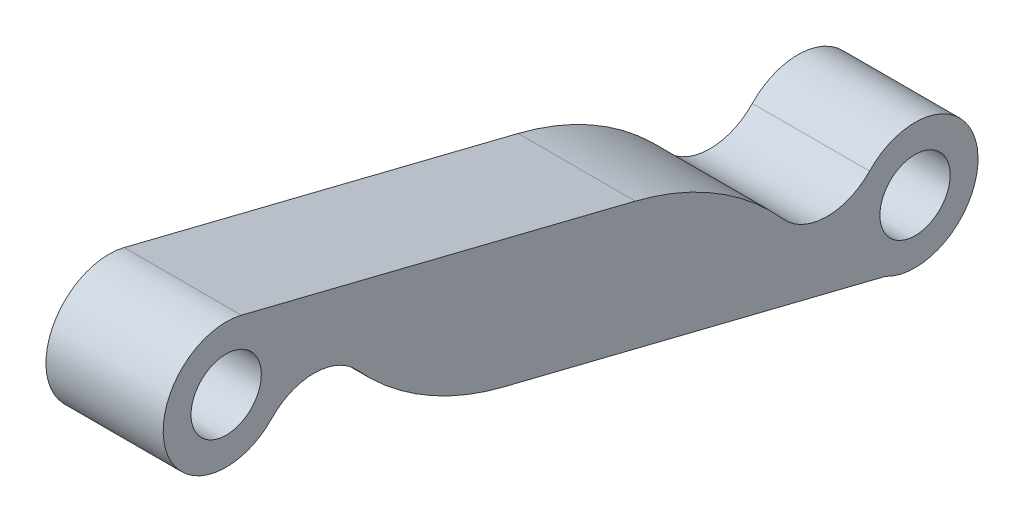
ISO-10303-21;
HEADER;
FILE_DESCRIPTION(('STEP AP214'),'2;1');
FILE_NAME('part.step','',(''),(''),'','','');
FILE_SCHEMA(('AUTOMOTIVE_DESIGN { 1 0 10303 214 1 1 1 1 }'));
ENDSEC;
DATA;
#1=APPLICATION_CONTEXT('core data for automotive mechanical design processes');
#2=APPLICATION_PROTOCOL_DEFINITION('international standard','automotive_design',2000,#1);
#3=PRODUCT_CONTEXT('',#1,'mechanical');
#4=PRODUCT('Part','Part','',(#3));
#5=PRODUCT_RELATED_PRODUCT_CATEGORY('part','',(#4));
#6=PRODUCT_DEFINITION_FORMATION('','',#4);
#7=PRODUCT_DEFINITION_CONTEXT('part definition',#1,'design');
#8=PRODUCT_DEFINITION('design','',#6,#7);
#9=PRODUCT_DEFINITION_SHAPE('','',#8);
#10=(LENGTH_UNIT() NAMED_UNIT(*) SI_UNIT(.MILLI.,.METRE.));
#11=(NAMED_UNIT(*) PLANE_ANGLE_UNIT() SI_UNIT($,.RADIAN.));
#12=(NAMED_UNIT(*) SI_UNIT($,.STERADIAN.) SOLID_ANGLE_UNIT());
#13=UNCERTAINTY_MEASURE_WITH_UNIT(LENGTH_MEASURE(1.E-05),#10,'distance_accuracy_value','');
#14=(GEOMETRIC_REPRESENTATION_CONTEXT(3) GLOBAL_UNCERTAINTY_ASSIGNED_CONTEXT((#13)) GLOBAL_UNIT_ASSIGNED_CONTEXT((#10,
#11,#12)) REPRESENTATION_CONTEXT('',''));
#15=CARTESIAN_POINT('',(0.,0.,0.));
#16=DIRECTION('',(0.,0.,1.));
#17=DIRECTION('',(1.,0.,0.));
#18=AXIS2_PLACEMENT_3D('',#15,#16,#17);
#19=CARTESIAN_POINT('',(-2.,-3.03108891324554,-26.340264052917));
#20=DIRECTION('',(1.,0.,0.));
#21=DIRECTION('',(0.,0.,-1.));
#22=AXIS2_PLACEMENT_3D('',#19,#20,#21);
#23=CYLINDRICAL_SURFACE('',#22,2.15);
#24=DIRECTION('',(1.,0.,0.));
#25=VECTOR('',#24,1.);
#26=CARTESIAN_POINT('',(-2.,-1.54552170545179,-24.7860471854472));
#27=LINE('',#26,#25);
#28=CARTESIAN_POINT('',(-2.,-1.54552170545179,-24.7860471854472));
#29=VERTEX_POINT('',#28);
#30=CARTESIAN_POINT('',(2.,-1.54552170545179,-24.7860471854472));
#31=VERTEX_POINT('',#30);
#32=EDGE_CURVE('E107',#29,#31,#27,.T.);
#33=ORIENTED_EDGE('',*,*,#32,.T.);
#34=CARTESIAN_POINT('',(2.,-3.03108891324554,-26.340264052917));
#35=DIRECTION('',(1.,0.,0.));
#36=DIRECTION('',(0.,0.,-1.));
#37=AXIS2_PLACEMENT_3D('',#34,#35,#36);
#38=CIRCLE('',#37,2.15);
#39=CARTESIAN_POINT('',(2.,-4.92963987266176,-25.3313020841096));
#40=VERTEX_POINT('',#39);
#41=EDGE_CURVE('E113',#40,#31,#38,.T.);
#42=ORIENTED_EDGE('',*,*,#41,.F.);
#43=DIRECTION('',(1.,0.,0.));
#44=VECTOR('',#43,1.);
#45=CARTESIAN_POINT('',(-2.,-4.92963987266176,-25.3313020841096));
#46=LINE('',#45,#44);
#47=CARTESIAN_POINT('',(-2.,-4.92963987266176,-25.3313020841096));
#48=VERTEX_POINT('',#47);
#49=EDGE_CURVE('E161',#48,#40,#46,.T.);
#50=ORIENTED_EDGE('',*,*,#49,.F.);
#51=CARTESIAN_POINT('',(-2.,-3.03108891324554,-26.340264052917));
#52=DIRECTION('',(1.,0.,0.));
#53=DIRECTION('',(0.,0.,-1.));
#54=AXIS2_PLACEMENT_3D('',#51,#52,#53);
#55=CIRCLE('',#54,2.15);
#56=EDGE_CURVE('E119',#48,#29,#55,.T.);
#57=ORIENTED_EDGE('',*,*,#56,.T.);
#58=EDGE_LOOP('',(#33,#42,#50,#57));
#59=FACE_BOUND('',#58,.T.);
#60=ADVANCED_FACE('F38',(#59),#23,.T.);
#61=CARTESIAN_POINT('',(-2.,1.30242376446451,-0.324584291710424));
#62=DIRECTION('',(0.,-0.970321327671409,0.24181919085547));
#63=DIRECTION('',(0.,-0.24181919085547,-0.970321327671409));
#64=AXIS2_PLACEMENT_3D('',#61,#62,#63);
#65=PLANE('',#64);
#66=DIRECTION('',(0.,-0.24181919085547,-0.970321327671409));
#67=VECTOR('',#66,1.);
#68=CARTESIAN_POINT('',(2.,1.30242376446451,-0.324584291710424));
#69=LINE('',#68,#67);
#70=CARTESIAN_POINT('',(2.,-1.68211993821428,-12.3003352560227));
#71=VERTEX_POINT('',#70);
#72=EDGE_CURVE('E127',#71,#40,#69,.T.);
#73=ORIENTED_EDGE('',*,*,#72,.F.);
#74=DIRECTION('',(-1.,0.,0.));
#75=VECTOR('',#74,1.);
#76=CARTESIAN_POINT('',(-2.,-1.68211993821428,-12.3003352560227));
#77=LINE('',#76,#75);
#78=CARTESIAN_POINT('',(-2.,-1.68211993821428,-12.3003352560227));
#79=VERTEX_POINT('',#78);
#80=EDGE_CURVE('E174',#71,#79,#77,.T.);
#81=ORIENTED_EDGE('',*,*,#80,.T.);
#82=DIRECTION('',(0.,-0.24181919085547,-0.970321327671409));
#83=VECTOR('',#82,1.);
#84=CARTESIAN_POINT('',(-2.,1.30242376446451,-0.324584291710424));
#85=LINE('',#84,#83);
#86=EDGE_CURVE('E157',#79,#48,#85,.T.);
#87=ORIENTED_EDGE('',*,*,#86,.T.);
#88=ORIENTED_EDGE('',*,*,#49,.T.);
#89=EDGE_LOOP('',(#73,#81,#87,#88));
#90=FACE_BOUND('',#89,.T.);
#91=ADVANCED_FACE('F192',(#90),#65,.T.);
#92=CARTESIAN_POINT('',(-2.,-0.0390630670417487,-5.8284271247462));
#93=DIRECTION('',(1.,0.,0.));
#94=DIRECTION('',(0.,0.,-1.));
#95=AXIS2_PLACEMENT_3D('',#92,#93,#94);
#96=CYLINDRICAL_SURFACE('',#95,2.);
#97=CARTESIAN_POINT('',(-2.,-0.0390630670417487,-5.8284271247462));
#98=DIRECTION('',(1.,0.,0.));
#99=DIRECTION('',(0.,0.,-1.));
#100=AXIS2_PLACEMENT_3D('',#97,#98,#99);
#101=CIRCLE('',#100,2.);
#102=CARTESIAN_POINT('',(-2.,1.30429633388184,-7.31011046471806));
#103=VERTEX_POINT('',#102);
#104=CARTESIAN_POINT('',(-2.,1.34285991695244,-4.38264399221608));
#105=VERTEX_POINT('',#104);
#106=EDGE_CURVE('E155',#103,#105,#101,.T.);
#107=ORIENTED_EDGE('',*,*,#106,.F.);
#108=DIRECTION('',(1.,0.,0.));
#109=VECTOR('',#108,1.);
#110=CARTESIAN_POINT('',(-2.,1.30429633388184,-7.31011046471806));
#111=LINE('',#110,#109);
#112=CARTESIAN_POINT('',(2.,1.30429633388184,-7.31011046471806));
#113=VERTEX_POINT('',#112);
#114=EDGE_CURVE('E163',#103,#113,#111,.T.);
#115=ORIENTED_EDGE('',*,*,#114,.T.);
#116=CARTESIAN_POINT('',(2.,-0.0390630670417487,-5.8284271247462));
#117=DIRECTION('',(1.,0.,0.));
#118=DIRECTION('',(0.,0.,-1.));
#119=AXIS2_PLACEMENT_3D('',#116,#117,#118);
#120=CIRCLE('',#119,2.);
#121=CARTESIAN_POINT('',(2.,1.34285991695244,-4.38264399221608));
#122=VERTEX_POINT('',#121);
#123=EDGE_CURVE('E138',#113,#122,#120,.T.);
#124=ORIENTED_EDGE('',*,*,#123,.T.);
#125=DIRECTION('',(1.,0.,0.));
#126=VECTOR('',#125,1.);
#127=CARTESIAN_POINT('',(-2.,1.34285991695244,-4.38264399221608));
#128=LINE('',#127,#126);
#129=EDGE_CURVE('E164',#105,#122,#128,.T.);
#130=ORIENTED_EDGE('',*,*,#129,.F.);
#131=EDGE_LOOP('',(#107,#115,#124,#130));
#132=FACE_BOUND('',#131,.T.);
#133=ADVANCED_FACE('F189',(#132),#96,.F.);
#134=CARTESIAN_POINT('',(-2.,2.82842712474619,-2.82842712474619));
#135=DIRECTION('',(1.,0.,0.));
#136=DIRECTION('',(0.,0.,-1.));
#137=AXIS2_PLACEMENT_3D('',#134,#135,#136);
#138=CYLINDRICAL_SURFACE('',#137,2.15);
#139=ORIENTED_EDGE('',*,*,#129,.T.);
#140=CARTESIAN_POINT('',(2.,2.82842712474619,-2.82842712474619));
#141=DIRECTION('',(1.,0.,0.));
#142=DIRECTION('',(0.,0.,-1.));
#143=AXIS2_PLACEMENT_3D('',#140,#141,#142);
#144=CIRCLE('',#143,2.15);
#145=CARTESIAN_POINT('',(2.,4.91461797923971,-3.34833838508546));
#146=VERTEX_POINT('',#145);
#147=EDGE_CURVE('E135',#146,#122,#144,.T.);
#148=ORIENTED_EDGE('',*,*,#147,.F.);
#149=DIRECTION('',(1.,0.,0.));
#150=VECTOR('',#149,1.);
#151=CARTESIAN_POINT('',(-2.,4.91461797923971,-3.34833838508546));
#152=LINE('',#151,#150);
#153=CARTESIAN_POINT('',(-2.,4.91461797923971,-3.34833838508546));
#154=VERTEX_POINT('',#153);
#155=EDGE_CURVE('E120',#154,#146,#152,.T.);
#156=ORIENTED_EDGE('',*,*,#155,.F.);
#157=CARTESIAN_POINT('',(-2.,2.82842712474619,-2.82842712474619));
#158=DIRECTION('',(1.,0.,0.));
#159=DIRECTION('',(0.,0.,-1.));
#160=AXIS2_PLACEMENT_3D('',#157,#158,#159);
#161=CIRCLE('',#160,2.15);
#162=EDGE_CURVE('E152',#154,#105,#161,.T.);
#163=ORIENTED_EDGE('',*,*,#162,.T.);
#164=EDGE_LOOP('',(#139,#148,#156,#163));
#165=FACE_BOUND('',#164,.T.);
#166=ADVANCED_FACE('F198',(#165),#138,.T.);
#167=CARTESIAN_POINT('',(-2.,5.41289009866615,-1.34897653645339));
#168=DIRECTION('',(0.,-0.970321327671409,0.24181919085547));
#169=DIRECTION('',(0.,-0.24181919085547,-0.970321327671409));
#170=AXIS2_PLACEMENT_3D('',#167,#168,#169);
#171=PLANE('',#170);
#172=DIRECTION('',(0.,-0.24181919085547,-0.970321327671409));
#173=VECTOR('',#172,1.);
#174=CARTESIAN_POINT('',(2.,5.41289009866615,-1.34897653645339));
#175=LINE('',#174,#173);
#176=CARTESIAN_POINT('',(2.,1.56418017069453,-16.7922724714049));
#177=VERTEX_POINT('',#176);
#178=EDGE_CURVE('E112',#146,#177,#175,.T.);
#179=ORIENTED_EDGE('',*,*,#178,.T.);
#180=DIRECTION('',(1.,0.,0.));
#181=VECTOR('',#180,1.);
#182=CARTESIAN_POINT('',(-2.,1.56418017069453,-16.7922724714049));
#183=LINE('',#182,#181);
#184=CARTESIAN_POINT('',(-2.,1.56418017069453,-16.7922724714049));
#185=VERTEX_POINT('',#184);
#186=EDGE_CURVE('E11',#177,#185,#183,.F.);
#187=ORIENTED_EDGE('',*,*,#186,.T.);
#188=DIRECTION('',(0.,-0.24181919085547,-0.970321327671409));
#189=VECTOR('',#188,1.);
#190=CARTESIAN_POINT('',(-2.,5.41289009866615,-1.34897653645339));
#191=LINE('',#190,#189);
#192=EDGE_CURVE('E150',#154,#185,#191,.T.);
#193=ORIENTED_EDGE('',*,*,#192,.F.);
#194=ORIENTED_EDGE('',*,*,#155,.T.);
#195=EDGE_LOOP('',(#179,#187,#193,#194));
#196=FACE_BOUND('',#195,.T.);
#197=ADVANCED_FACE('F195',(#196),#171,.F.);
#198=CARTESIAN_POINT('',(-2.,-0.163598721457601,-23.3402640529171));
#199=DIRECTION('',(1.,0.,0.));
#200=DIRECTION('',(0.,0.,-1.));
#201=AXIS2_PLACEMENT_3D('',#198,#199,#200);
#202=CYLINDRICAL_SURFACE('',#201,2.);
#203=CARTESIAN_POINT('',(-2.,-0.163598721457601,-23.3402640529171));
#204=DIRECTION('',(1.,0.,0.));
#205=DIRECTION('',(0.,0.,-1.));
#206=AXIS2_PLACEMENT_3D('',#203,#204,#205);
#207=CIRCLE('',#206,2.);
#208=CARTESIAN_POINT('',(-2.,-1.49283778555126,-21.8459001379059));
#209=VERTEX_POINT('',#208);
#210=EDGE_CURVE('E148',#209,#29,#207,.T.);
#211=ORIENTED_EDGE('',*,*,#210,.F.);
#212=DIRECTION('',(1.,0.,0.));
#213=VECTOR('',#212,1.);
#214=CARTESIAN_POINT('',(-2.,-1.49283778555126,-21.8459001379059));
#215=LINE('',#214,#213);
#216=CARTESIAN_POINT('',(2.,-1.49283778555126,-21.8459001379059));
#217=VERTEX_POINT('',#216);
#218=EDGE_CURVE('E46',#209,#217,#215,.T.);
#219=ORIENTED_EDGE('',*,*,#218,.T.);
#220=CARTESIAN_POINT('',(2.,-0.163598721457601,-23.3402640529171));
#221=DIRECTION('',(1.,0.,0.));
#222=DIRECTION('',(0.,0.,-1.));
#223=AXIS2_PLACEMENT_3D('',#220,#221,#222);
#224=CIRCLE('',#223,2.);
#225=EDGE_CURVE('E104',#217,#31,#224,.T.);
#226=ORIENTED_EDGE('',*,*,#225,.T.);
#227=ORIENTED_EDGE('',*,*,#32,.F.);
#228=EDGE_LOOP('',(#211,#219,#226,#227));
#229=FACE_BOUND('',#228,.T.);
#230=ADVANCED_FACE('F106',(#229),#202,.F.);
#231=CARTESIAN_POINT('',(-2.,-3.03108891324554,-26.340264052917));
#232=DIRECTION('',(1.,0.,0.));
#233=DIRECTION('',(0.,0.,-1.));
#234=AXIS2_PLACEMENT_3D('',#231,#232,#233);
#235=CYLINDRICAL_SURFACE('',#234,1.2);
#236=CARTESIAN_POINT('',(-2.,-3.03108891324554,-26.340264052917));
#237=DIRECTION('',(1.,0.,0.));
#238=DIRECTION('',(0.,0.,-1.));
#239=AXIS2_PLACEMENT_3D('',#236,#237,#238);
#240=CIRCLE('',#239,1.2);
#241=CARTESIAN_POINT('',(-2.,-3.03108891324554,-27.540264052917));
#242=VERTEX_POINT('',#241);
#243=EDGE_CURVE('E144',#242,#242,#240,.T.);
#244=ORIENTED_EDGE('',*,*,#243,.F.);
#245=EDGE_LOOP('',(#244));
#246=FACE_BOUND('',#245,.T.);
#247=CARTESIAN_POINT('',(2.,-3.03108891324554,-26.340264052917));
#248=DIRECTION('',(1.,0.,0.));
#249=DIRECTION('',(0.,0.,-1.));
#250=AXIS2_PLACEMENT_3D('',#247,#248,#249);
#251=CIRCLE('',#250,1.2);
#252=CARTESIAN_POINT('',(2.,-3.03108891324554,-27.540264052917));
#253=VERTEX_POINT('',#252);
#254=EDGE_CURVE('E129',#253,#253,#251,.T.);
#255=ORIENTED_EDGE('',*,*,#254,.T.);
#256=EDGE_LOOP('',(#255));
#257=FACE_BOUND('',#256,.T.);
#258=ADVANCED_FACE('F215',(#246,#257),#235,.F.);
#259=CARTESIAN_POINT('',(-2.,2.82842712474619,-2.82842712474619));
#260=DIRECTION('',(1.,0.,0.));
#261=DIRECTION('',(0.,0.,-1.));
#262=AXIS2_PLACEMENT_3D('',#259,#260,#261);
#263=CYLINDRICAL_SURFACE('',#262,1.2);
#264=CARTESIAN_POINT('',(-2.,2.82842712474619,-2.82842712474619));
#265=DIRECTION('',(1.,0.,0.));
#266=DIRECTION('',(0.,0.,-1.));
#267=AXIS2_PLACEMENT_3D('',#264,#265,#266);
#268=CIRCLE('',#267,1.2);
#269=CARTESIAN_POINT('',(-2.,2.82842712474619,-4.02842712474619));
#270=VERTEX_POINT('',#269);
#271=EDGE_CURVE('E121',#270,#270,#268,.T.);
#272=ORIENTED_EDGE('',*,*,#271,.F.);
#273=EDGE_LOOP('',(#272));
#274=FACE_BOUND('',#273,.T.);
#275=CARTESIAN_POINT('',(2.,2.82842712474619,-2.82842712474619));
#276=DIRECTION('',(1.,0.,0.));
#277=DIRECTION('',(0.,0.,-1.));
#278=AXIS2_PLACEMENT_3D('',#275,#276,#277);
#279=CIRCLE('',#278,1.2);
#280=CARTESIAN_POINT('',(2.,2.82842712474619,-4.02842712474619));
#281=VERTEX_POINT('',#280);
#282=EDGE_CURVE('E141',#281,#281,#279,.T.);
#283=ORIENTED_EDGE('',*,*,#282,.T.);
#284=EDGE_LOOP('',(#283));
#285=FACE_BOUND('',#284,.T.);
#286=ADVANCED_FACE('F217',(#274,#285),#263,.F.);
#287=CARTESIAN_POINT('',(-2.,0.,0.));
#288=DIRECTION('',(1.,0.,0.));
#289=DIRECTION('',(0.,0.,-1.));
#290=AXIS2_PLACEMENT_3D('',#287,#288,#289);
#291=PLANE('',#290);
#292=ORIENTED_EDGE('',*,*,#243,.T.);
#293=EDGE_LOOP('',(#292));
#294=FACE_BOUND('',#293,.T.);
#295=ORIENTED_EDGE('',*,*,#86,.F.);
#296=CARTESIAN_POINT('',(-2.,8.02109333849981,-14.7185271645774));
#297=DIRECTION('',(1.,0.,0.));
#298=DIRECTION('',(0.,0.,-1.));
#299=AXIS2_PLACEMENT_3D('',#296,#297,#298);
#300=CIRCLE('',#299,10.);
#301=EDGE_CURVE('E177',#79,#103,#300,.F.);
#302=ORIENTED_EDGE('',*,*,#301,.T.);
#303=ORIENTED_EDGE('',*,*,#106,.T.);
#304=ORIENTED_EDGE('',*,*,#162,.F.);
#305=ORIENTED_EDGE('',*,*,#192,.T.);
#306=CARTESIAN_POINT('',(-2.,-8.13903310601956,-14.3740805628502));
#307=DIRECTION('',(1.,0.,0.));
#308=DIRECTION('',(0.,0.,-1.));
#309=AXIS2_PLACEMENT_3D('',#306,#307,#308);
#310=CIRCLE('',#309,10.);
#311=EDGE_CURVE('E53',#185,#209,#310,.F.);
#312=ORIENTED_EDGE('',*,*,#311,.T.);
#313=ORIENTED_EDGE('',*,*,#210,.T.);
#314=ORIENTED_EDGE('',*,*,#56,.F.);
#315=EDGE_LOOP('',(#295,#302,#303,#304,#305,#312,#313,#314));
#316=FACE_BOUND('',#315,.T.);
#317=ORIENTED_EDGE('',*,*,#271,.T.);
#318=EDGE_LOOP('',(#317));
#319=FACE_BOUND('',#318,.T.);
#320=ADVANCED_FACE('F181',(#294,#316,#319),#291,.F.);
#321=CARTESIAN_POINT('',(2.,0.,0.));
#322=DIRECTION('',(1.,0.,0.));
#323=DIRECTION('',(0.,0.,-1.));
#324=AXIS2_PLACEMENT_3D('',#321,#322,#323);
#325=PLANE('',#324);
#326=ORIENTED_EDGE('',*,*,#254,.F.);
#327=EDGE_LOOP('',(#326));
#328=FACE_BOUND('',#327,.T.);
#329=ORIENTED_EDGE('',*,*,#123,.F.);
#330=CARTESIAN_POINT('',(2.,8.02109333849981,-14.7185271645774));
#331=DIRECTION('',(1.,0.,0.));
#332=DIRECTION('',(0.,0.,-1.));
#333=AXIS2_PLACEMENT_3D('',#330,#331,#332);
#334=CIRCLE('',#333,10.);
#335=EDGE_CURVE('E172',#113,#71,#334,.T.);
#336=ORIENTED_EDGE('',*,*,#335,.T.);
#337=ORIENTED_EDGE('',*,*,#72,.T.);
#338=ORIENTED_EDGE('',*,*,#41,.T.);
#339=ORIENTED_EDGE('',*,*,#225,.F.);
#340=CARTESIAN_POINT('',(2.,-8.13903310601956,-14.3740805628502));
#341=DIRECTION('',(1.,0.,0.));
#342=DIRECTION('',(0.,0.,-1.));
#343=AXIS2_PLACEMENT_3D('',#340,#341,#342);
#344=CIRCLE('',#343,10.);
#345=EDGE_CURVE('E170',#217,#177,#344,.T.);
#346=ORIENTED_EDGE('',*,*,#345,.T.);
#347=ORIENTED_EDGE('',*,*,#178,.F.);
#348=ORIENTED_EDGE('',*,*,#147,.T.);
#349=EDGE_LOOP('',(#329,#336,#337,#338,#339,#346,#347,#348));
#350=FACE_BOUND('',#349,.T.);
#351=ORIENTED_EDGE('',*,*,#282,.F.);
#352=EDGE_LOOP('',(#351));
#353=FACE_BOUND('',#352,.T.);
#354=ADVANCED_FACE('F124',(#328,#350,#353),#325,.T.);
#355=CARTESIAN_POINT('',(-2.,8.02109333849981,-14.7185271645774));
#356=DIRECTION('',(1.,0.,0.));
#357=DIRECTION('',(0.,0.,-1.));
#358=AXIS2_PLACEMENT_3D('',#355,#356,#357);
#359=CYLINDRICAL_SURFACE('',#358,10.);
#360=ORIENTED_EDGE('',*,*,#301,.F.);
#361=ORIENTED_EDGE('',*,*,#80,.F.);
#362=ORIENTED_EDGE('',*,*,#335,.F.);
#363=ORIENTED_EDGE('',*,*,#114,.F.);
#364=EDGE_LOOP('',(#360,#361,#362,#363));
#365=FACE_BOUND('',#364,.T.);
#366=ADVANCED_FACE('F190',(#365),#359,.T.);
#367=CARTESIAN_POINT('',(-2.,-8.13903310601956,-14.3740805628502));
#368=DIRECTION('',(1.,0.,0.));
#369=DIRECTION('',(0.,0.,-1.));
#370=AXIS2_PLACEMENT_3D('',#367,#368,#369);
#371=CYLINDRICAL_SURFACE('',#370,10.);
#372=ORIENTED_EDGE('',*,*,#311,.F.);
#373=ORIENTED_EDGE('',*,*,#186,.F.);
#374=ORIENTED_EDGE('',*,*,#345,.F.);
#375=ORIENTED_EDGE('',*,*,#218,.F.);
#376=EDGE_LOOP('',(#372,#373,#374,#375));
#377=FACE_BOUND('',#376,.T.);
#378=ADVANCED_FACE('F40',(#377),#371,.T.);
#379=CLOSED_SHELL('',(#60,#91,#133,#166,#197,#230,#258,#286,#320,#354,#366,#378));
#380=MANIFOLD_SOLID_BREP('B2',#379);
#381=ADVANCED_BREP_SHAPE_REPRESENTATION('',(#18,#380),#14);
#382=SHAPE_DEFINITION_REPRESENTATION(#9,#381);
ENDSEC;
END-ISO-10303-21;
